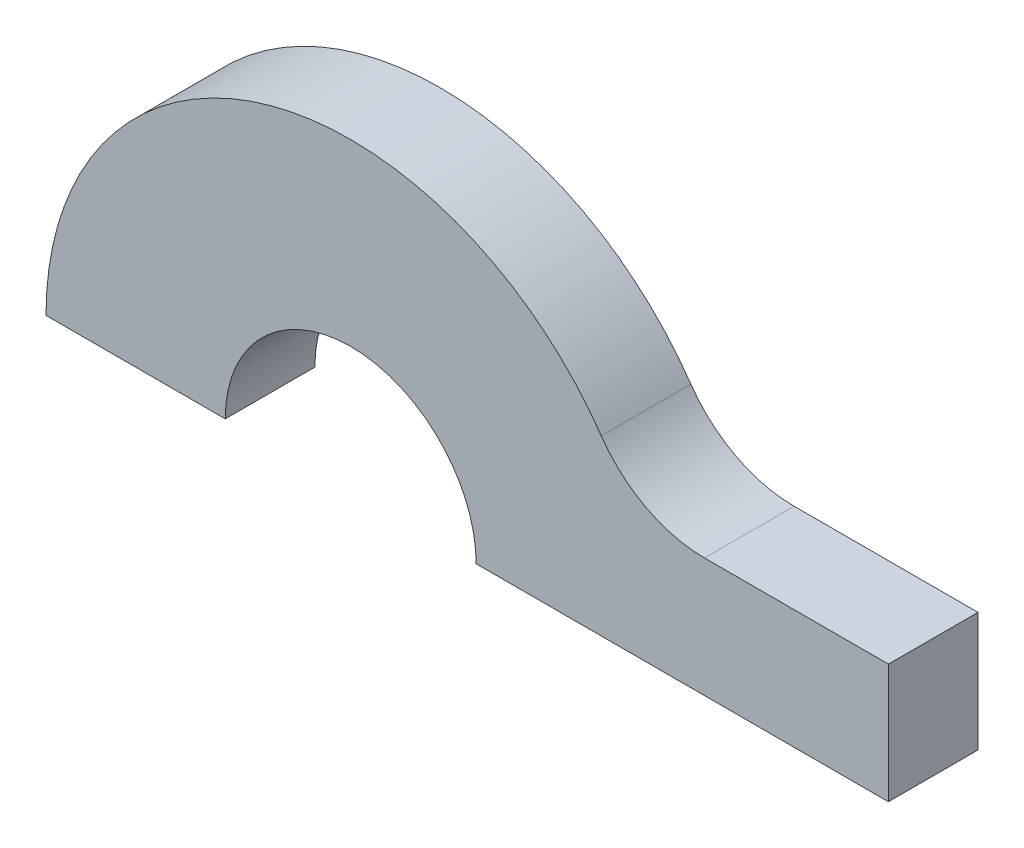
ISO-10303-21;
HEADER;
FILE_DESCRIPTION(('STEP AP214'),'2;1');
FILE_NAME('part.step','',(''),(''),'','','');
FILE_SCHEMA(('AUTOMOTIVE_DESIGN { 1 0 10303 214 1 1 1 1 }'));
ENDSEC;
DATA;
#1=APPLICATION_CONTEXT('core data for automotive mechanical design processes');
#2=APPLICATION_PROTOCOL_DEFINITION('international standard','automotive_design',2000,#1);
#3=PRODUCT_CONTEXT('',#1,'mechanical');
#4=PRODUCT('Part','Part','',(#3));
#5=PRODUCT_RELATED_PRODUCT_CATEGORY('part','',(#4));
#6=PRODUCT_DEFINITION_FORMATION('','',#4);
#7=PRODUCT_DEFINITION_CONTEXT('part definition',#1,'design');
#8=PRODUCT_DEFINITION('design','',#6,#7);
#9=PRODUCT_DEFINITION_SHAPE('','',#8);
#10=(LENGTH_UNIT() NAMED_UNIT(*) SI_UNIT(.MILLI.,.METRE.));
#11=(NAMED_UNIT(*) PLANE_ANGLE_UNIT() SI_UNIT($,.RADIAN.));
#12=(NAMED_UNIT(*) SI_UNIT($,.STERADIAN.) SOLID_ANGLE_UNIT());
#13=UNCERTAINTY_MEASURE_WITH_UNIT(LENGTH_MEASURE(1.E-05),#10,'distance_accuracy_value','');
#14=(GEOMETRIC_REPRESENTATION_CONTEXT(3) GLOBAL_UNCERTAINTY_ASSIGNED_CONTEXT((#13)) GLOBAL_UNIT_ASSIGNED_CONTEXT((#10,
#11,#12)) REPRESENTATION_CONTEXT('',''));
#15=CARTESIAN_POINT('',(0.,0.,0.));
#16=DIRECTION('',(0.,0.,1.));
#17=DIRECTION('',(1.,0.,0.));
#18=AXIS2_PLACEMENT_3D('',#15,#16,#17);
#19=CARTESIAN_POINT('',(0.,0.,12.7));
#20=DIRECTION('',(0.,0.,-1.));
#21=DIRECTION('',(-1.,0.,0.));
#22=AXIS2_PLACEMENT_3D('',#19,#20,#21);
#23=CYLINDRICAL_SURFACE('',#22,17.78);
#24=DIRECTION('',(0.,0.,-1.));
#25=VECTOR('',#24,1.);
#26=CARTESIAN_POINT('',(0.,17.78,12.7));
#27=LINE('',#26,#25);
#28=CARTESIAN_POINT('',(0.,17.78,0.));
#29=VERTEX_POINT('',#28);
#30=CARTESIAN_POINT('',(0.,17.78,12.7));
#31=VERTEX_POINT('',#30);
#32=EDGE_CURVE('E11',#29,#31,#27,.F.);
#33=ORIENTED_EDGE('',*,*,#32,.F.);
#34=CARTESIAN_POINT('',(0.,0.,0.));
#35=DIRECTION('',(0.,0.,-1.));
#36=DIRECTION('',(-1.,0.,0.));
#37=AXIS2_PLACEMENT_3D('',#34,#35,#36);
#38=CIRCLE('',#37,17.78);
#39=CARTESIAN_POINT('',(17.78,0.,0.));
#40=VERTEX_POINT('',#39);
#41=EDGE_CURVE('E114',#29,#40,#38,.T.);
#42=ORIENTED_EDGE('',*,*,#41,.T.);
#43=DIRECTION('',(0.,0.,-1.));
#44=VECTOR('',#43,1.);
#45=CARTESIAN_POINT('',(17.78,0.,12.7));
#46=LINE('',#45,#44);
#47=CARTESIAN_POINT('',(17.78,0.,12.7));
#48=VERTEX_POINT('',#47);
#49=EDGE_CURVE('E160',#48,#40,#46,.T.);
#50=ORIENTED_EDGE('',*,*,#49,.F.);
#51=CARTESIAN_POINT('',(0.,0.,12.7));
#52=DIRECTION('',(0.,0.,-1.));
#53=DIRECTION('',(-1.,0.,0.));
#54=AXIS2_PLACEMENT_3D('',#51,#52,#53);
#55=CIRCLE('',#54,17.78);
#56=EDGE_CURVE('E139',#31,#48,#55,.T.);
#57=ORIENTED_EDGE('',*,*,#56,.F.);
#58=EDGE_LOOP('',(#33,#42,#50,#57));
#59=FACE_BOUND('',#58,.T.);
#60=ADVANCED_FACE('F41',(#59),#23,.F.);
#61=CARTESIAN_POINT('',(0.,0.,12.7));
#62=DIRECTION('',(0.,0.,-1.));
#63=DIRECTION('',(-1.,0.,0.));
#64=AXIS2_PLACEMENT_3D('',#61,#62,#63);
#65=CYLINDRICAL_SURFACE('',#64,43.18);
#66=CARTESIAN_POINT('',(0.,0.,12.7));
#67=DIRECTION('',(0.,0.,-1.));
#68=DIRECTION('',(-1.,0.,0.));
#69=AXIS2_PLACEMENT_3D('',#66,#67,#68);
#70=CIRCLE('',#69,43.18);
#71=CARTESIAN_POINT('',(-43.18,0.,12.7));
#72=VERTEX_POINT('',#71);
#73=CARTESIAN_POINT('',(35.5160011559491,24.558625,12.7));
#74=VERTEX_POINT('',#73);
#75=EDGE_CURVE('E141',#72,#74,#70,.T.);
#76=ORIENTED_EDGE('',*,*,#75,.T.);
#77=DIRECTION('',(0.,0.,-1.));
#78=VECTOR('',#77,1.);
#79=CARTESIAN_POINT('',(35.5160011559491,24.558625,12.7));
#80=LINE('',#79,#78);
#81=CARTESIAN_POINT('',(35.5160011559491,24.558625,0.));
#82=VERTEX_POINT('',#81);
#83=EDGE_CURVE('E164',#74,#82,#80,.T.);
#84=ORIENTED_EDGE('',*,*,#83,.T.);
#85=CARTESIAN_POINT('',(0.,0.,0.));
#86=DIRECTION('',(0.,0.,-1.));
#87=DIRECTION('',(-1.,0.,0.));
#88=AXIS2_PLACEMENT_3D('',#85,#86,#87);
#89=CIRCLE('',#88,43.18);
#90=CARTESIAN_POINT('',(-43.18,0.,0.));
#91=VERTEX_POINT('',#90);
#92=EDGE_CURVE('E151',#91,#82,#89,.T.);
#93=ORIENTED_EDGE('',*,*,#92,.F.);
#94=DIRECTION('',(0.,0.,-1.));
#95=VECTOR('',#94,1.);
#96=CARTESIAN_POINT('',(-43.18,0.,12.7));
#97=LINE('',#96,#95);
#98=EDGE_CURVE('E158',#72,#91,#97,.T.);
#99=ORIENTED_EDGE('',*,*,#98,.F.);
#100=EDGE_LOOP('',(#76,#84,#93,#99));
#101=FACE_BOUND('',#100,.T.);
#102=ADVANCED_FACE('F177',(#101),#65,.T.);
#103=CARTESIAN_POINT('',(-17.78,0.,0.));
#104=VERTEX_POINT('',#103);
#105=EDGE_CURVE('E147',#104,#29,#38,.T.);
#106=ORIENTED_EDGE('',*,*,#105,.T.);
#107=ORIENTED_EDGE('',*,*,#32,.T.);
#108=CARTESIAN_POINT('',(-17.78,0.,12.7));
#109=VERTEX_POINT('',#108);
#110=EDGE_CURVE('E137',#109,#31,#55,.T.);
#111=ORIENTED_EDGE('',*,*,#110,.F.);
#112=DIRECTION('',(0.,0.,-1.));
#113=VECTOR('',#112,1.);
#114=CARTESIAN_POINT('',(-17.78,0.,12.7));
#115=LINE('',#114,#113);
#116=EDGE_CURVE('E146',#109,#104,#115,.T.);
#117=ORIENTED_EDGE('',*,*,#116,.T.);
#118=EDGE_LOOP('',(#106,#107,#111,#117));
#119=FACE_BOUND('',#118,.T.);
#120=ADVANCED_FACE('F182',(#119),#23,.F.);
#121=CARTESIAN_POINT('',(17.78,0.,12.7));
#122=DIRECTION('',(0.,1.,0.));
#123=DIRECTION('',(0.,0.,1.));
#124=AXIS2_PLACEMENT_3D('',#121,#122,#123);
#125=PLANE('',#124);
#126=DIRECTION('',(1.,0.,0.));
#127=VECTOR('',#126,1.);
#128=CARTESIAN_POINT('',(17.78,0.,0.));
#129=LINE('',#128,#127);
#130=CARTESIAN_POINT('',(76.2,0.,0.));
#131=VERTEX_POINT('',#130);
#132=EDGE_CURVE('E149',#40,#131,#129,.T.);
#133=ORIENTED_EDGE('',*,*,#132,.T.);
#134=DIRECTION('',(0.,0.,-1.));
#135=VECTOR('',#134,1.);
#136=CARTESIAN_POINT('',(76.2,0.,12.7));
#137=LINE('',#136,#135);
#138=CARTESIAN_POINT('',(76.2,0.,12.7));
#139=VERTEX_POINT('',#138);
#140=EDGE_CURVE('E134',#139,#131,#137,.T.);
#141=ORIENTED_EDGE('',*,*,#140,.F.);
#142=DIRECTION('',(1.,0.,0.));
#143=VECTOR('',#142,1.);
#144=CARTESIAN_POINT('',(17.78,0.,12.7));
#145=LINE('',#144,#143);
#146=EDGE_CURVE('E129',#48,#139,#145,.T.);
#147=ORIENTED_EDGE('',*,*,#146,.F.);
#148=ORIENTED_EDGE('',*,*,#49,.T.);
#149=EDGE_LOOP('',(#133,#141,#147,#148));
#150=FACE_BOUND('',#149,.T.);
#151=ADVANCED_FACE('F186',(#150),#125,.F.);
#152=CARTESIAN_POINT('',(-43.18,0.,12.7));
#153=DIRECTION('',(0.,1.,0.));
#154=DIRECTION('',(0.,0.,1.));
#155=AXIS2_PLACEMENT_3D('',#152,#153,#154);
#156=PLANE('',#155);
#157=DIRECTION('',(1.,0.,0.));
#158=VECTOR('',#157,1.);
#159=CARTESIAN_POINT('',(-43.18,0.,0.));
#160=LINE('',#159,#158);
#161=EDGE_CURVE('E154',#91,#104,#160,.T.);
#162=ORIENTED_EDGE('',*,*,#161,.T.);
#163=ORIENTED_EDGE('',*,*,#116,.F.);
#164=DIRECTION('',(1.,0.,0.));
#165=VECTOR('',#164,1.);
#166=CARTESIAN_POINT('',(-43.18,0.,12.7));
#167=LINE('',#166,#165);
#168=EDGE_CURVE('E144',#72,#109,#167,.T.);
#169=ORIENTED_EDGE('',*,*,#168,.F.);
#170=ORIENTED_EDGE('',*,*,#98,.T.);
#171=EDGE_LOOP('',(#162,#163,#169,#170));
#172=FACE_BOUND('',#171,.T.);
#173=ADVANCED_FACE('F181',(#172),#156,.F.);
#174=CARTESIAN_POINT('',(0.,0.,12.7));
#175=DIRECTION('',(0.,0.,-1.));
#176=DIRECTION('',(-1.,0.,0.));
#177=AXIS2_PLACEMENT_3D('',#174,#175,#176);
#178=PLANE('',#177);
#179=ORIENTED_EDGE('',*,*,#110,.T.);
#180=ORIENTED_EDGE('',*,*,#56,.T.);
#181=ORIENTED_EDGE('',*,*,#146,.T.);
#182=DIRECTION('',(0.,1.,0.));
#183=VECTOR('',#182,1.);
#184=CARTESIAN_POINT('',(76.2,0.,12.7));
#185=LINE('',#184,#183);
#186=CARTESIAN_POINT('',(76.2,16.891,12.7));
#187=VERTEX_POINT('',#186);
#188=EDGE_CURVE('E122',#139,#187,#185,.T.);
#189=ORIENTED_EDGE('',*,*,#188,.T.);
#190=DIRECTION('',(1.,0.,0.));
#191=VECTOR('',#190,1.);
#192=CARTESIAN_POINT('',(-43.181,16.891,12.7));
#193=LINE('',#192,#191);
#194=CARTESIAN_POINT('',(50.1402369260457,16.891,12.7));
#195=VERTEX_POINT('',#194);
#196=EDGE_CURVE('E105',#195,#187,#193,.T.);
#197=ORIENTED_EDGE('',*,*,#196,.F.);
#198=CARTESIAN_POINT('',(50.1402369260457,34.671,12.7));
#199=DIRECTION('',(0.,0.,-1.));
#200=DIRECTION('',(-1.,0.,0.));
#201=AXIS2_PLACEMENT_3D('',#198,#199,#200);
#202=CIRCLE('',#201,17.78);
#203=EDGE_CURVE('E166',#195,#74,#202,.T.);
#204=ORIENTED_EDGE('',*,*,#203,.T.);
#205=ORIENTED_EDGE('',*,*,#75,.F.);
#206=ORIENTED_EDGE('',*,*,#168,.T.);
#207=EDGE_LOOP('',(#179,#180,#181,#189,#197,#204,#205,#206));
#208=FACE_BOUND('',#207,.T.);
#209=ADVANCED_FACE('F127',(#208),#178,.F.);
#210=CARTESIAN_POINT('',(0.,0.,0.));
#211=DIRECTION('',(0.,0.,-1.));
#212=DIRECTION('',(-1.,0.,0.));
#213=AXIS2_PLACEMENT_3D('',#210,#211,#212);
#214=PLANE('',#213);
#215=ORIENTED_EDGE('',*,*,#105,.F.);
#216=ORIENTED_EDGE('',*,*,#161,.F.);
#217=ORIENTED_EDGE('',*,*,#92,.T.);
#218=CARTESIAN_POINT('',(50.1402369260457,34.671,0.));
#219=DIRECTION('',(0.,0.,-1.));
#220=DIRECTION('',(-1.,0.,0.));
#221=AXIS2_PLACEMENT_3D('',#218,#219,#220);
#222=CIRCLE('',#221,17.78);
#223=CARTESIAN_POINT('',(50.1402369260457,16.891,0.));
#224=VERTEX_POINT('',#223);
#225=EDGE_CURVE('E50',#82,#224,#222,.F.);
#226=ORIENTED_EDGE('',*,*,#225,.T.);
#227=DIRECTION('',(1.,0.,0.));
#228=VECTOR('',#227,1.);
#229=CARTESIAN_POINT('',(-43.181,16.891,0.));
#230=LINE('',#229,#228);
#231=CARTESIAN_POINT('',(76.2,16.891,0.));
#232=VERTEX_POINT('',#231);
#233=EDGE_CURVE('E115',#224,#232,#230,.T.);
#234=ORIENTED_EDGE('',*,*,#233,.T.);
#235=DIRECTION('',(0.,-1.,0.));
#236=VECTOR('',#235,1.);
#237=CARTESIAN_POINT('',(76.2,16.891,0.));
#238=LINE('',#237,#236);
#239=EDGE_CURVE('E124',#232,#131,#238,.T.);
#240=ORIENTED_EDGE('',*,*,#239,.T.);
#241=ORIENTED_EDGE('',*,*,#132,.F.);
#242=ORIENTED_EDGE('',*,*,#41,.F.);
#243=EDGE_LOOP('',(#215,#216,#217,#226,#234,#240,#241,#242));
#244=FACE_BOUND('',#243,.T.);
#245=ADVANCED_FACE('F170',(#244),#214,.T.);
#246=CARTESIAN_POINT('',(-43.181,16.891,12.7));
#247=DIRECTION('',(0.,-1.,0.));
#248=DIRECTION('',(0.,0.,-1.));
#249=AXIS2_PLACEMENT_3D('',#246,#247,#248);
#250=PLANE('',#249);
#251=ORIENTED_EDGE('',*,*,#233,.F.);
#252=DIRECTION('',(0.,0.,-1.));
#253=VECTOR('',#252,1.);
#254=CARTESIAN_POINT('',(50.1402369260457,16.891,12.7));
#255=LINE('',#254,#253);
#256=EDGE_CURVE('E111',#224,#195,#255,.F.);
#257=ORIENTED_EDGE('',*,*,#256,.T.);
#258=ORIENTED_EDGE('',*,*,#196,.T.);
#259=DIRECTION('',(0.,0.,-1.));
#260=VECTOR('',#259,1.);
#261=CARTESIAN_POINT('',(76.2,16.891,12.7));
#262=LINE('',#261,#260);
#263=EDGE_CURVE('E109',#187,#232,#262,.T.);
#264=ORIENTED_EDGE('',*,*,#263,.T.);
#265=EDGE_LOOP('',(#251,#257,#258,#264));
#266=FACE_BOUND('',#265,.T.);
#267=ADVANCED_FACE('F108',(#266),#250,.F.);
#268=CARTESIAN_POINT('',(76.2,16.891,12.7));
#269=DIRECTION('',(-1.,0.,0.));
#270=DIRECTION('',(0.,0.,1.));
#271=AXIS2_PLACEMENT_3D('',#268,#269,#270);
#272=PLANE('',#271);
#273=ORIENTED_EDGE('',*,*,#188,.F.);
#274=ORIENTED_EDGE('',*,*,#140,.T.);
#275=ORIENTED_EDGE('',*,*,#239,.F.);
#276=ORIENTED_EDGE('',*,*,#263,.F.);
#277=EDGE_LOOP('',(#273,#274,#275,#276));
#278=FACE_BOUND('',#277,.T.);
#279=ADVANCED_FACE('F120',(#278),#272,.F.);
#280=CARTESIAN_POINT('',(50.1402369260457,34.671,12.7));
#281=DIRECTION('',(0.,0.,-1.));
#282=DIRECTION('',(-1.,0.,0.));
#283=AXIS2_PLACEMENT_3D('',#280,#281,#282);
#284=CYLINDRICAL_SURFACE('',#283,17.78);
#285=ORIENTED_EDGE('',*,*,#225,.F.);
#286=ORIENTED_EDGE('',*,*,#83,.F.);
#287=ORIENTED_EDGE('',*,*,#203,.F.);
#288=ORIENTED_EDGE('',*,*,#256,.F.);
#289=EDGE_LOOP('',(#285,#286,#287,#288));
#290=FACE_BOUND('',#289,.T.);
#291=ADVANCED_FACE('F43',(#290),#284,.F.);
#292=CLOSED_SHELL('',(#60,#102,#120,#151,#173,#209,#245,#267,#279,#291));
#293=MANIFOLD_SOLID_BREP('B2',#292);
#294=ADVANCED_BREP_SHAPE_REPRESENTATION('',(#18,#293),#14);
#295=SHAPE_DEFINITION_REPRESENTATION(#9,#294);
ENDSEC;
END-ISO-10303-21;
